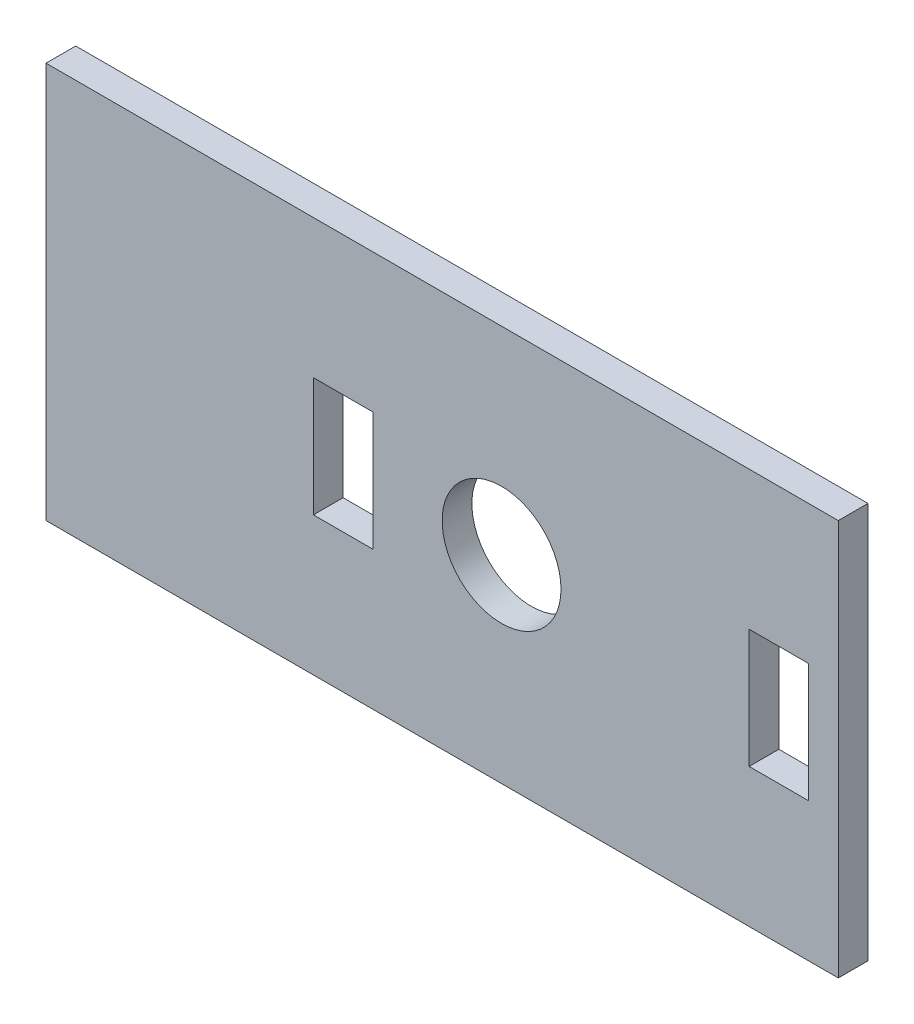
ISO-10303-21;
HEADER;
FILE_DESCRIPTION(('STEP AP214'),'2;1');
FILE_NAME('part.step','',(''),(''),'','','');
FILE_SCHEMA(('AUTOMOTIVE_DESIGN { 1 0 10303 214 1 1 1 1 }'));
ENDSEC;
DATA;
#1=APPLICATION_CONTEXT('core data for automotive mechanical design processes');
#2=APPLICATION_PROTOCOL_DEFINITION('international standard','automotive_design',2000,#1);
#3=PRODUCT_CONTEXT('',#1,'mechanical');
#4=PRODUCT('Part','Part','',(#3));
#5=PRODUCT_RELATED_PRODUCT_CATEGORY('part','',(#4));
#6=PRODUCT_DEFINITION_FORMATION('','',#4);
#7=PRODUCT_DEFINITION_CONTEXT('part definition',#1,'design');
#8=PRODUCT_DEFINITION('design','',#6,#7);
#9=PRODUCT_DEFINITION_SHAPE('','',#8);
#10=(LENGTH_UNIT() NAMED_UNIT(*) SI_UNIT(.MILLI.,.METRE.));
#11=(NAMED_UNIT(*) PLANE_ANGLE_UNIT() SI_UNIT($,.RADIAN.));
#12=(NAMED_UNIT(*) SI_UNIT($,.STERADIAN.) SOLID_ANGLE_UNIT());
#13=UNCERTAINTY_MEASURE_WITH_UNIT(LENGTH_MEASURE(1.E-05),#10,'distance_accuracy_value','');
#14=(GEOMETRIC_REPRESENTATION_CONTEXT(3) GLOBAL_UNCERTAINTY_ASSIGNED_CONTEXT((#13)) GLOBAL_UNIT_ASSIGNED_CONTEXT((#10,
#11,#12)) REPRESENTATION_CONTEXT('',''));
#15=CARTESIAN_POINT('',(0.,0.,0.));
#16=DIRECTION('',(0.,0.,1.));
#17=DIRECTION('',(1.,0.,0.));
#18=AXIS2_PLACEMENT_3D('',#15,#16,#17);
#19=CARTESIAN_POINT('',(0.,0.,1.5));
#20=DIRECTION('',(0.,0.,1.));
#21=DIRECTION('',(1.,0.,0.));
#22=AXIS2_PLACEMENT_3D('',#19,#20,#21);
#23=PLANE('',#22);
#24=DIRECTION('',(-1.,0.,0.));
#25=VECTOR('',#24,1.);
#26=CARTESIAN_POINT('',(-6.5,3.00000000000001,1.5));
#27=LINE('',#26,#25);
#28=CARTESIAN_POINT('',(-3.5,3.00000000000001,1.5));
#29=VERTEX_POINT('',#28);
#30=CARTESIAN_POINT('',(-6.5,3.00000000000001,1.5));
#31=VERTEX_POINT('',#30);
#32=EDGE_CURVE('E188',#29,#31,#27,.T.);
#33=ORIENTED_EDGE('',*,*,#32,.F.);
#34=DIRECTION('',(0.,1.,0.));
#35=VECTOR('',#34,1.);
#36=CARTESIAN_POINT('',(-3.5,3.00000000000001,1.5));
#37=LINE('',#36,#35);
#38=CARTESIAN_POINT('',(-3.50000000000001,-2.99999999999999,1.5));
#39=VERTEX_POINT('',#38);
#40=EDGE_CURVE('E185',#39,#29,#37,.T.);
#41=ORIENTED_EDGE('',*,*,#40,.F.);
#42=DIRECTION('',(1.,0.,0.));
#43=VECTOR('',#42,1.);
#44=CARTESIAN_POINT('',(-6.5,-2.99999999999999,1.5));
#45=LINE('',#44,#43);
#46=CARTESIAN_POINT('',(-6.5,-2.99999999999999,1.5));
#47=VERTEX_POINT('',#46);
#48=EDGE_CURVE('E196',#47,#39,#45,.T.);
#49=ORIENTED_EDGE('',*,*,#48,.F.);
#50=DIRECTION('',(0.,-1.,0.));
#51=VECTOR('',#50,1.);
#52=CARTESIAN_POINT('',(-6.5,3.00000000000001,1.5));
#53=LINE('',#52,#51);
#54=EDGE_CURVE('E192',#31,#47,#53,.T.);
#55=ORIENTED_EDGE('',*,*,#54,.F.);
#56=EDGE_LOOP('',(#33,#41,#49,#55));
#57=FACE_BOUND('',#56,.T.);
#58=DIRECTION('',(0.,1.,0.));
#59=VECTOR('',#58,1.);
#60=CARTESIAN_POINT('',(20.,10.,1.5));
#61=LINE('',#60,#59);
#62=CARTESIAN_POINT('',(20.,-10.,1.5));
#63=VERTEX_POINT('',#62);
#64=CARTESIAN_POINT('',(20.,10.,1.5));
#65=VERTEX_POINT('',#64);
#66=EDGE_CURVE('E228',#63,#65,#61,.T.);
#67=ORIENTED_EDGE('',*,*,#66,.T.);
#68=DIRECTION('',(-1.,0.,0.));
#69=VECTOR('',#68,1.);
#70=CARTESIAN_POINT('',(-20.,10.,1.5));
#71=LINE('',#70,#69);
#72=CARTESIAN_POINT('',(-20.,10.,1.5));
#73=VERTEX_POINT('',#72);
#74=EDGE_CURVE('E232',#65,#73,#71,.T.);
#75=ORIENTED_EDGE('',*,*,#74,.T.);
#76=DIRECTION('',(0.,-1.,0.));
#77=VECTOR('',#76,1.);
#78=CARTESIAN_POINT('',(-20.,10.,1.5));
#79=LINE('',#78,#77);
#80=CARTESIAN_POINT('',(-20.,-10.,1.5));
#81=VERTEX_POINT('',#80);
#82=EDGE_CURVE('E236',#73,#81,#79,.T.);
#83=ORIENTED_EDGE('',*,*,#82,.T.);
#84=DIRECTION('',(1.,0.,0.));
#85=VECTOR('',#84,1.);
#86=CARTESIAN_POINT('',(-20.,-10.,1.5));
#87=LINE('',#86,#85);
#88=EDGE_CURVE('E239',#81,#63,#87,.T.);
#89=ORIENTED_EDGE('',*,*,#88,.T.);
#90=EDGE_LOOP('',(#67,#75,#83,#89));
#91=FACE_BOUND('',#90,.T.);
#92=CARTESIAN_POINT('',(3.,0.,1.5));
#93=DIRECTION('',(0.,0.,1.));
#94=DIRECTION('',(1.,0.,0.));
#95=AXIS2_PLACEMENT_3D('',#92,#93,#94);
#96=CIRCLE('',#95,3.);
#97=CARTESIAN_POINT('',(6.,0.,1.5));
#98=VERTEX_POINT('',#97);
#99=EDGE_CURVE('E177',#98,#98,#96,.T.);
#100=ORIENTED_EDGE('',*,*,#99,.F.);
#101=EDGE_LOOP('',(#100));
#102=FACE_BOUND('',#101,.T.);
#103=DIRECTION('',(-1.,0.,0.));
#104=VECTOR('',#103,1.);
#105=CARTESIAN_POINT('',(15.5,3.,1.5));
#106=LINE('',#105,#104);
#107=CARTESIAN_POINT('',(18.5,3.,1.5));
#108=VERTEX_POINT('',#107);
#109=CARTESIAN_POINT('',(15.5,3.,1.5));
#110=VERTEX_POINT('',#109);
#111=EDGE_CURVE('E138',#108,#110,#106,.T.);
#112=ORIENTED_EDGE('',*,*,#111,.F.);
#113=DIRECTION('',(0.,1.,0.));
#114=VECTOR('',#113,1.);
#115=CARTESIAN_POINT('',(18.5,3.,1.5));
#116=LINE('',#115,#114);
#117=CARTESIAN_POINT('',(18.5,-3.,1.5));
#118=VERTEX_POINT('',#117);
#119=EDGE_CURVE('E129',#118,#108,#116,.T.);
#120=ORIENTED_EDGE('',*,*,#119,.F.);
#121=DIRECTION('',(1.,0.,0.));
#122=VECTOR('',#121,1.);
#123=CARTESIAN_POINT('',(15.5,-3.,1.5));
#124=LINE('',#123,#122);
#125=CARTESIAN_POINT('',(15.5,-3.,1.5));
#126=VERTEX_POINT('',#125);
#127=EDGE_CURVE('E155',#126,#118,#124,.T.);
#128=ORIENTED_EDGE('',*,*,#127,.F.);
#129=DIRECTION('',(0.,-1.,0.));
#130=VECTOR('',#129,1.);
#131=CARTESIAN_POINT('',(15.5,3.,1.5));
#132=LINE('',#131,#130);
#133=EDGE_CURVE('E151',#110,#126,#132,.T.);
#134=ORIENTED_EDGE('',*,*,#133,.F.);
#135=EDGE_LOOP('',(#112,#120,#128,#134));
#136=FACE_BOUND('',#135,.T.);
#137=ADVANCED_FACE('F39',(#57,#91,#102,#136),#23,.T.);
#138=CARTESIAN_POINT('',(0.,0.,0.));
#139=DIRECTION('',(0.,0.,1.));
#140=DIRECTION('',(1.,0.,0.));
#141=AXIS2_PLACEMENT_3D('',#138,#139,#140);
#142=PLANE('',#141);
#143=CARTESIAN_POINT('',(3.,0.,0.));
#144=DIRECTION('',(0.,0.,1.));
#145=DIRECTION('',(1.,0.,0.));
#146=AXIS2_PLACEMENT_3D('',#143,#144,#145);
#147=CIRCLE('',#146,3.);
#148=CARTESIAN_POINT('',(6.,0.,0.));
#149=VERTEX_POINT('',#148);
#150=EDGE_CURVE('E147',#149,#149,#147,.T.);
#151=ORIENTED_EDGE('',*,*,#150,.T.);
#152=EDGE_LOOP('',(#151));
#153=FACE_BOUND('',#152,.T.);
#154=DIRECTION('',(0.,1.,0.));
#155=VECTOR('',#154,1.);
#156=CARTESIAN_POINT('',(-3.5,3.00000000000001,0.));
#157=LINE('',#156,#155);
#158=CARTESIAN_POINT('',(-3.50000000000001,-2.99999999999999,0.));
#159=VERTEX_POINT('',#158);
#160=CARTESIAN_POINT('',(-3.5,3.00000000000001,0.));
#161=VERTEX_POINT('',#160);
#162=EDGE_CURVE('E181',#159,#161,#157,.T.);
#163=ORIENTED_EDGE('',*,*,#162,.T.);
#164=DIRECTION('',(-1.,0.,0.));
#165=VECTOR('',#164,1.);
#166=CARTESIAN_POINT('',(-6.5,3.00000000000001,0.));
#167=LINE('',#166,#165);
#168=CARTESIAN_POINT('',(-6.5,3.00000000000001,0.));
#169=VERTEX_POINT('',#168);
#170=EDGE_CURVE('E203',#161,#169,#167,.T.);
#171=ORIENTED_EDGE('',*,*,#170,.T.);
#172=DIRECTION('',(0.,-1.,0.));
#173=VECTOR('',#172,1.);
#174=CARTESIAN_POINT('',(-6.5,3.00000000000001,0.));
#175=LINE('',#174,#173);
#176=CARTESIAN_POINT('',(-6.5,-2.99999999999999,0.));
#177=VERTEX_POINT('',#176);
#178=EDGE_CURVE('E207',#169,#177,#175,.T.);
#179=ORIENTED_EDGE('',*,*,#178,.T.);
#180=DIRECTION('',(1.,0.,0.));
#181=VECTOR('',#180,1.);
#182=CARTESIAN_POINT('',(-6.5,-2.99999999999999,0.));
#183=LINE('',#182,#181);
#184=EDGE_CURVE('E189',#177,#159,#183,.T.);
#185=ORIENTED_EDGE('',*,*,#184,.T.);
#186=EDGE_LOOP('',(#163,#171,#179,#185));
#187=FACE_BOUND('',#186,.T.);
#188=DIRECTION('',(0.,1.,0.));
#189=VECTOR('',#188,1.);
#190=CARTESIAN_POINT('',(20.,10.,0.));
#191=LINE('',#190,#189);
#192=CARTESIAN_POINT('',(20.,-10.,0.));
#193=VERTEX_POINT('',#192);
#194=CARTESIAN_POINT('',(20.,10.,0.));
#195=VERTEX_POINT('',#194);
#196=EDGE_CURVE('E227',#193,#195,#191,.T.);
#197=ORIENTED_EDGE('',*,*,#196,.F.);
#198=DIRECTION('',(1.,0.,0.));
#199=VECTOR('',#198,1.);
#200=CARTESIAN_POINT('',(-20.,-10.,0.));
#201=LINE('',#200,#199);
#202=CARTESIAN_POINT('',(-20.,-10.,0.));
#203=VERTEX_POINT('',#202);
#204=EDGE_CURVE('E233',#203,#193,#201,.T.);
#205=ORIENTED_EDGE('',*,*,#204,.F.);
#206=DIRECTION('',(0.,-1.,0.));
#207=VECTOR('',#206,1.);
#208=CARTESIAN_POINT('',(-20.,10.,0.));
#209=LINE('',#208,#207);
#210=CARTESIAN_POINT('',(-20.,10.,0.));
#211=VERTEX_POINT('',#210);
#212=EDGE_CURVE('E249',#211,#203,#209,.T.);
#213=ORIENTED_EDGE('',*,*,#212,.F.);
#214=DIRECTION('',(-1.,0.,0.));
#215=VECTOR('',#214,1.);
#216=CARTESIAN_POINT('',(-20.,10.,0.));
#217=LINE('',#216,#215);
#218=EDGE_CURVE('E246',#195,#211,#217,.T.);
#219=ORIENTED_EDGE('',*,*,#218,.F.);
#220=EDGE_LOOP('',(#197,#205,#213,#219));
#221=FACE_BOUND('',#220,.T.);
#222=DIRECTION('',(0.,1.,0.));
#223=VECTOR('',#222,1.);
#224=CARTESIAN_POINT('',(18.5,3.,0.));
#225=LINE('',#224,#223);
#226=CARTESIAN_POINT('',(18.5,-3.,0.));
#227=VERTEX_POINT('',#226);
#228=CARTESIAN_POINT('',(18.5,3.,0.));
#229=VERTEX_POINT('',#228);
#230=EDGE_CURVE('E63',#227,#229,#225,.T.);
#231=ORIENTED_EDGE('',*,*,#230,.T.);
#232=DIRECTION('',(-1.,0.,0.));
#233=VECTOR('',#232,1.);
#234=CARTESIAN_POINT('',(15.5,3.,0.));
#235=LINE('',#234,#233);
#236=CARTESIAN_POINT('',(15.5,3.,0.));
#237=VERTEX_POINT('',#236);
#238=EDGE_CURVE('E145',#229,#237,#235,.T.);
#239=ORIENTED_EDGE('',*,*,#238,.T.);
#240=DIRECTION('',(0.,-1.,0.));
#241=VECTOR('',#240,1.);
#242=CARTESIAN_POINT('',(15.5,3.,0.));
#243=LINE('',#242,#241);
#244=CARTESIAN_POINT('',(15.5,-3.,0.));
#245=VERTEX_POINT('',#244);
#246=EDGE_CURVE('E164',#237,#245,#243,.T.);
#247=ORIENTED_EDGE('',*,*,#246,.T.);
#248=DIRECTION('',(1.,0.,0.));
#249=VECTOR('',#248,1.);
#250=CARTESIAN_POINT('',(15.5,-3.,0.));
#251=LINE('',#250,#249);
#252=EDGE_CURVE('E139',#245,#227,#251,.T.);
#253=ORIENTED_EDGE('',*,*,#252,.T.);
#254=EDGE_LOOP('',(#231,#239,#247,#253));
#255=FACE_BOUND('',#254,.T.);
#256=ADVANCED_FACE('F272',(#153,#187,#221,#255),#142,.F.);
#257=CARTESIAN_POINT('',(20.,10.,1.5));
#258=DIRECTION('',(-1.,0.,0.));
#259=DIRECTION('',(0.,-1.,0.));
#260=AXIS2_PLACEMENT_3D('',#257,#258,#259);
#261=PLANE('',#260);
#262=ORIENTED_EDGE('',*,*,#196,.T.);
#263=DIRECTION('',(0.,0.,-1.));
#264=VECTOR('',#263,1.);
#265=CARTESIAN_POINT('',(20.,10.,1.5));
#266=LINE('',#265,#264);
#267=EDGE_CURVE('E11',#65,#195,#266,.T.);
#268=ORIENTED_EDGE('',*,*,#267,.F.);
#269=ORIENTED_EDGE('',*,*,#66,.F.);
#270=DIRECTION('',(0.,0.,-1.));
#271=VECTOR('',#270,1.);
#272=CARTESIAN_POINT('',(20.,-10.,1.5));
#273=LINE('',#272,#271);
#274=EDGE_CURVE('E242',#63,#193,#273,.T.);
#275=ORIENTED_EDGE('',*,*,#274,.T.);
#276=EDGE_LOOP('',(#262,#268,#269,#275));
#277=FACE_BOUND('',#276,.T.);
#278=ADVANCED_FACE('F41',(#277),#261,.F.);
#279=CARTESIAN_POINT('',(-20.,10.,1.5));
#280=DIRECTION('',(0.,-1.,0.));
#281=DIRECTION('',(0.,0.,-1.));
#282=AXIS2_PLACEMENT_3D('',#279,#280,#281);
#283=PLANE('',#282);
#284=ORIENTED_EDGE('',*,*,#218,.T.);
#285=DIRECTION('',(0.,0.,-1.));
#286=VECTOR('',#285,1.);
#287=CARTESIAN_POINT('',(-20.,10.,1.5));
#288=LINE('',#287,#286);
#289=EDGE_CURVE('E48',#73,#211,#288,.T.);
#290=ORIENTED_EDGE('',*,*,#289,.F.);
#291=ORIENTED_EDGE('',*,*,#74,.F.);
#292=ORIENTED_EDGE('',*,*,#267,.T.);
#293=EDGE_LOOP('',(#284,#290,#291,#292));
#294=FACE_BOUND('',#293,.T.);
#295=ADVANCED_FACE('F283',(#294),#283,.F.);
#296=CARTESIAN_POINT('',(-20.,10.,1.5));
#297=DIRECTION('',(1.,0.,0.));
#298=DIRECTION('',(0.,1.,0.));
#299=AXIS2_PLACEMENT_3D('',#296,#297,#298);
#300=PLANE('',#299);
#301=ORIENTED_EDGE('',*,*,#212,.T.);
#302=DIRECTION('',(0.,0.,-1.));
#303=VECTOR('',#302,1.);
#304=CARTESIAN_POINT('',(-20.,-10.,1.5));
#305=LINE('',#304,#303);
#306=EDGE_CURVE('E257',#81,#203,#305,.T.);
#307=ORIENTED_EDGE('',*,*,#306,.F.);
#308=ORIENTED_EDGE('',*,*,#82,.F.);
#309=ORIENTED_EDGE('',*,*,#289,.T.);
#310=EDGE_LOOP('',(#301,#307,#308,#309));
#311=FACE_BOUND('',#310,.T.);
#312=ADVANCED_FACE('F266',(#311),#300,.F.);
#313=CARTESIAN_POINT('',(-20.,-10.,1.5));
#314=DIRECTION('',(0.,1.,0.));
#315=DIRECTION('',(0.,0.,1.));
#316=AXIS2_PLACEMENT_3D('',#313,#314,#315);
#317=PLANE('',#316);
#318=ORIENTED_EDGE('',*,*,#204,.T.);
#319=ORIENTED_EDGE('',*,*,#274,.F.);
#320=ORIENTED_EDGE('',*,*,#88,.F.);
#321=ORIENTED_EDGE('',*,*,#306,.T.);
#322=EDGE_LOOP('',(#318,#319,#320,#321));
#323=FACE_BOUND('',#322,.T.);
#324=ADVANCED_FACE('F276',(#323),#317,.F.);
#325=CARTESIAN_POINT('',(-3.5,3.00000000000001,1.5));
#326=DIRECTION('',(-1.,0.,0.));
#327=DIRECTION('',(0.,-1.,0.));
#328=AXIS2_PLACEMENT_3D('',#325,#326,#327);
#329=PLANE('',#328);
#330=ORIENTED_EDGE('',*,*,#162,.F.);
#331=DIRECTION('',(0.,0.,-1.));
#332=VECTOR('',#331,1.);
#333=CARTESIAN_POINT('',(-3.50000000000001,-2.99999999999999,1.5));
#334=LINE('',#333,#332);
#335=EDGE_CURVE('E199',#39,#159,#334,.T.);
#336=ORIENTED_EDGE('',*,*,#335,.F.);
#337=ORIENTED_EDGE('',*,*,#40,.T.);
#338=DIRECTION('',(0.,0.,-1.));
#339=VECTOR('',#338,1.);
#340=CARTESIAN_POINT('',(-3.5,3.00000000000001,1.5));
#341=LINE('',#340,#339);
#342=EDGE_CURVE('E223',#29,#161,#341,.T.);
#343=ORIENTED_EDGE('',*,*,#342,.T.);
#344=EDGE_LOOP('',(#330,#336,#337,#343));
#345=FACE_BOUND('',#344,.T.);
#346=ADVANCED_FACE('F300',(#345),#329,.T.);
#347=CARTESIAN_POINT('',(-6.5,3.00000000000001,1.5));
#348=DIRECTION('',(0.,-1.,0.));
#349=DIRECTION('',(0.,0.,-1.));
#350=AXIS2_PLACEMENT_3D('',#347,#348,#349);
#351=PLANE('',#350);
#352=ORIENTED_EDGE('',*,*,#170,.F.);
#353=ORIENTED_EDGE('',*,*,#342,.F.);
#354=ORIENTED_EDGE('',*,*,#32,.T.);
#355=DIRECTION('',(0.,0.,-1.));
#356=VECTOR('',#355,1.);
#357=CARTESIAN_POINT('',(-6.5,3.00000000000001,1.5));
#358=LINE('',#357,#356);
#359=EDGE_CURVE('E220',#31,#169,#358,.T.);
#360=ORIENTED_EDGE('',*,*,#359,.T.);
#361=EDGE_LOOP('',(#352,#353,#354,#360));
#362=FACE_BOUND('',#361,.T.);
#363=ADVANCED_FACE('F307',(#362),#351,.T.);
#364=CARTESIAN_POINT('',(-6.5,3.00000000000001,1.5));
#365=DIRECTION('',(1.,0.,0.));
#366=DIRECTION('',(0.,0.,-1.));
#367=AXIS2_PLACEMENT_3D('',#364,#365,#366);
#368=PLANE('',#367);
#369=ORIENTED_EDGE('',*,*,#178,.F.);
#370=ORIENTED_EDGE('',*,*,#359,.F.);
#371=ORIENTED_EDGE('',*,*,#54,.T.);
#372=DIRECTION('',(0.,0.,-1.));
#373=VECTOR('',#372,1.);
#374=CARTESIAN_POINT('',(-6.5,-2.99999999999999,1.5));
#375=LINE('',#374,#373);
#376=EDGE_CURVE('E217',#47,#177,#375,.T.);
#377=ORIENTED_EDGE('',*,*,#376,.T.);
#378=EDGE_LOOP('',(#369,#370,#371,#377));
#379=FACE_BOUND('',#378,.T.);
#380=ADVANCED_FACE('F312',(#379),#368,.T.);
#381=CARTESIAN_POINT('',(-6.5,-2.99999999999999,1.5));
#382=DIRECTION('',(0.,1.,0.));
#383=DIRECTION('',(0.,0.,1.));
#384=AXIS2_PLACEMENT_3D('',#381,#382,#383);
#385=PLANE('',#384);
#386=ORIENTED_EDGE('',*,*,#184,.F.);
#387=ORIENTED_EDGE('',*,*,#376,.F.);
#388=ORIENTED_EDGE('',*,*,#48,.T.);
#389=ORIENTED_EDGE('',*,*,#335,.T.);
#390=EDGE_LOOP('',(#386,#387,#388,#389));
#391=FACE_BOUND('',#390,.T.);
#392=ADVANCED_FACE('F320',(#391),#385,.T.);
#393=CARTESIAN_POINT('',(3.,0.,1.5));
#394=DIRECTION('',(0.,0.,-1.));
#395=DIRECTION('',(-1.,0.,0.));
#396=AXIS2_PLACEMENT_3D('',#393,#394,#395);
#397=CYLINDRICAL_SURFACE('',#396,3.);
#398=ORIENTED_EDGE('',*,*,#99,.T.);
#399=EDGE_LOOP('',(#398));
#400=FACE_BOUND('',#399,.T.);
#401=ORIENTED_EDGE('',*,*,#150,.F.);
#402=EDGE_LOOP('',(#401));
#403=FACE_BOUND('',#402,.T.);
#404=ADVANCED_FACE('F331',(#400,#403),#397,.F.);
#405=CARTESIAN_POINT('',(18.5,3.,1.5));
#406=DIRECTION('',(-1.,0.,0.));
#407=DIRECTION('',(0.,-1.,0.));
#408=AXIS2_PLACEMENT_3D('',#405,#406,#407);
#409=PLANE('',#408);
#410=ORIENTED_EDGE('',*,*,#230,.F.);
#411=DIRECTION('',(0.,0.,-1.));
#412=VECTOR('',#411,1.);
#413=CARTESIAN_POINT('',(18.5,-3.,1.5));
#414=LINE('',#413,#412);
#415=EDGE_CURVE('E133',#118,#227,#414,.T.);
#416=ORIENTED_EDGE('',*,*,#415,.F.);
#417=ORIENTED_EDGE('',*,*,#119,.T.);
#418=DIRECTION('',(0.,0.,-1.));
#419=VECTOR('',#418,1.);
#420=CARTESIAN_POINT('',(18.5,3.,1.5));
#421=LINE('',#420,#419);
#422=EDGE_CURVE('E132',#108,#229,#421,.T.);
#423=ORIENTED_EDGE('',*,*,#422,.T.);
#424=EDGE_LOOP('',(#410,#416,#417,#423));
#425=FACE_BOUND('',#424,.T.);
#426=ADVANCED_FACE('F131',(#425),#409,.T.);
#427=CARTESIAN_POINT('',(15.5,3.,1.5));
#428=DIRECTION('',(0.,-1.,0.));
#429=DIRECTION('',(0.,0.,-1.));
#430=AXIS2_PLACEMENT_3D('',#427,#428,#429);
#431=PLANE('',#430);
#432=ORIENTED_EDGE('',*,*,#238,.F.);
#433=ORIENTED_EDGE('',*,*,#422,.F.);
#434=ORIENTED_EDGE('',*,*,#111,.T.);
#435=DIRECTION('',(0.,0.,-1.));
#436=VECTOR('',#435,1.);
#437=CARTESIAN_POINT('',(15.5,3.,1.5));
#438=LINE('',#437,#436);
#439=EDGE_CURVE('E148',#110,#237,#438,.T.);
#440=ORIENTED_EDGE('',*,*,#439,.T.);
#441=EDGE_LOOP('',(#432,#433,#434,#440));
#442=FACE_BOUND('',#441,.T.);
#443=ADVANCED_FACE('F142',(#442),#431,.T.);
#444=CARTESIAN_POINT('',(15.5,3.,1.5));
#445=DIRECTION('',(1.,0.,0.));
#446=DIRECTION('',(0.,0.,-1.));
#447=AXIS2_PLACEMENT_3D('',#444,#445,#446);
#448=PLANE('',#447);
#449=ORIENTED_EDGE('',*,*,#246,.F.);
#450=ORIENTED_EDGE('',*,*,#439,.F.);
#451=ORIENTED_EDGE('',*,*,#133,.T.);
#452=DIRECTION('',(0.,0.,-1.));
#453=VECTOR('',#452,1.);
#454=CARTESIAN_POINT('',(15.5,-3.,1.5));
#455=LINE('',#454,#453);
#456=EDGE_CURVE('E55',#126,#245,#455,.T.);
#457=ORIENTED_EDGE('',*,*,#456,.T.);
#458=EDGE_LOOP('',(#449,#450,#451,#457));
#459=FACE_BOUND('',#458,.T.);
#460=ADVANCED_FACE('F341',(#459),#448,.T.);
#461=CARTESIAN_POINT('',(15.5,-3.,1.5));
#462=DIRECTION('',(0.,1.,0.));
#463=DIRECTION('',(0.,0.,1.));
#464=AXIS2_PLACEMENT_3D('',#461,#462,#463);
#465=PLANE('',#464);
#466=ORIENTED_EDGE('',*,*,#252,.F.);
#467=ORIENTED_EDGE('',*,*,#456,.F.);
#468=ORIENTED_EDGE('',*,*,#127,.T.);
#469=ORIENTED_EDGE('',*,*,#415,.T.);
#470=EDGE_LOOP('',(#466,#467,#468,#469));
#471=FACE_BOUND('',#470,.T.);
#472=ADVANCED_FACE('F344',(#471),#465,.T.);
#473=CLOSED_SHELL('',(#137,#256,#278,#295,#312,#324,#346,#363,#380,#392,#404,#426,#443,#460,#472));
#474=MANIFOLD_SOLID_BREP('B2',#473);
#475=ADVANCED_BREP_SHAPE_REPRESENTATION('',(#18,#474),#14);
#476=SHAPE_DEFINITION_REPRESENTATION(#9,#475);
ENDSEC;
END-ISO-10303-21;
